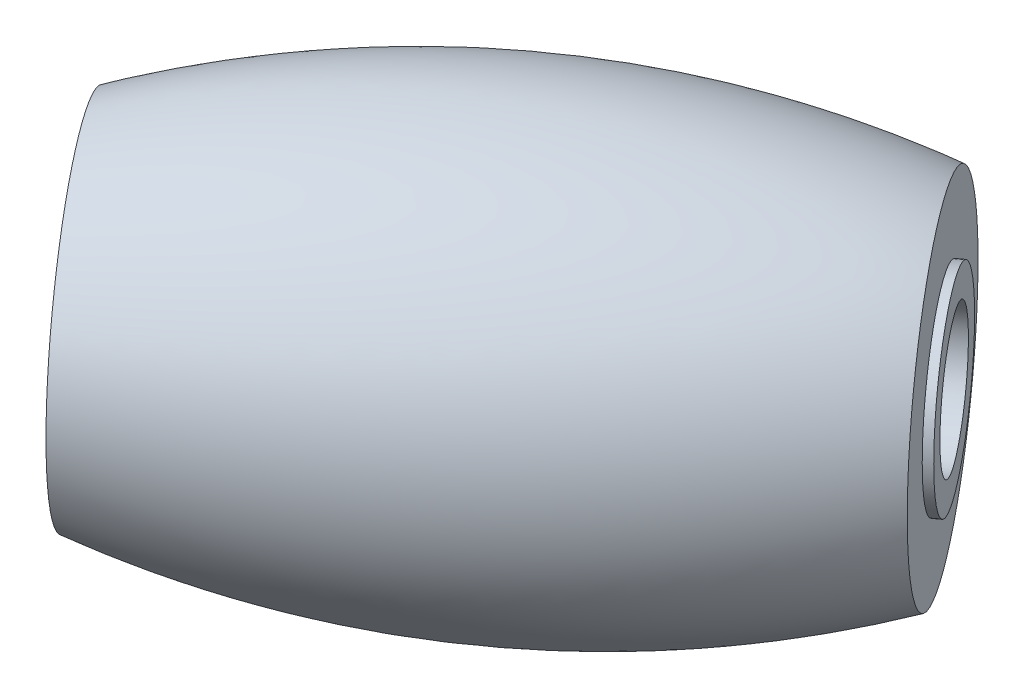
ISO-10303-21;
HEADER;
FILE_DESCRIPTION(('STEP AP214'),'2;1');
FILE_NAME('part.step','',(''),(''),'','','');
FILE_SCHEMA(('AUTOMOTIVE_DESIGN { 1 0 10303 214 1 1 1 1 }'));
ENDSEC;
DATA;
#1=APPLICATION_CONTEXT('core data for automotive mechanical design processes');
#2=APPLICATION_PROTOCOL_DEFINITION('international standard','automotive_design',2000,#1);
#3=PRODUCT_CONTEXT('',#1,'mechanical');
#4=PRODUCT('Part','Part','',(#3));
#5=PRODUCT_RELATED_PRODUCT_CATEGORY('part','',(#4));
#6=PRODUCT_DEFINITION_FORMATION('','',#4);
#7=PRODUCT_DEFINITION_CONTEXT('part definition',#1,'design');
#8=PRODUCT_DEFINITION('design','',#6,#7);
#9=PRODUCT_DEFINITION_SHAPE('','',#8);
#10=(LENGTH_UNIT() NAMED_UNIT(*) SI_UNIT(.MILLI.,.METRE.));
#11=(NAMED_UNIT(*) PLANE_ANGLE_UNIT() SI_UNIT($,.RADIAN.));
#12=(NAMED_UNIT(*) SI_UNIT($,.STERADIAN.) SOLID_ANGLE_UNIT());
#13=UNCERTAINTY_MEASURE_WITH_UNIT(LENGTH_MEASURE(1.E-05),#10,'distance_accuracy_value','');
#14=(GEOMETRIC_REPRESENTATION_CONTEXT(3) GLOBAL_UNCERTAINTY_ASSIGNED_CONTEXT((#13)) GLOBAL_UNIT_ASSIGNED_CONTEXT((#10,
#11,#12)) REPRESENTATION_CONTEXT('',''));
#15=CARTESIAN_POINT('',(0.,0.,0.));
#16=DIRECTION('',(0.,0.,1.));
#17=DIRECTION('',(1.,0.,0.));
#18=AXIS2_PLACEMENT_3D('',#15,#16,#17);
#19=CARTESIAN_POINT('',(-2.7324804469588,19.5,-20.10985167523));
#20=CARTESIAN_POINT('',(-6.53966451495307,19.5,-14.5576434821438));
#21=CARTESIAN_POINT('',(-11.9860776218319,19.5,-10.6005927349104));
#22=CARTESIAN_POINT('',(-18.4430259814176,19.5,-8.69547220628071));
#23=(BOUNDED_CURVE() B_SPLINE_CURVE(3,(#19,#20,#21,#22),.UNSPECIFIED.,.F.,
.F.) B_SPLINE_CURVE_WITH_KNOTS((4,4),(0.,1.),
.UNSPECIFIED.) CURVE() GEOMETRIC_REPRESENTATION_ITEM() RATIONAL_B_SPLINE_CURVE((1.,
0.961522456838992,0.961522456838992,1.)) REPRESENTATION_ITEM(''));
#24=CARTESIAN_POINT('',(-13.36575966883,19.5,-18.22625979987));
#25=DIRECTION('',(-0.809016994377869,0.,0.587785252288452));
#26=AXIS1_PLACEMENT('',#24,#25);
#27=SURFACE_OF_REVOLUTION('',#23,#26);
#28=CARTESIAN_POINT('',(-5.80145077141528,19.5,-23.7220519087537));
#29=DIRECTION('',(-0.809016994377869,0.,0.587785252288452));
#30=DIRECTION('',(0.587785252288452,0.,0.809016994377869));
#31=AXIS2_PLACEMENT_3D('',#28,#29,#30);
#32=CIRCLE('',#31,4.8513660861917);
#33=CARTESIAN_POINT('',(-2.94988933249946,19.5,-19.7972142990762));
#34=VERTEX_POINT('',#33);
#35=EDGE_CURVE('E19',#34,#34,#32,.T.);
#36=ORIENTED_EDGE('',*,*,#35,.T.);
#37=EDGE_LOOP('',(#36));
#38=FACE_BOUND('',#37,.T.);
#39=CARTESIAN_POINT('',(-20.9300685662801,19.5,-12.7304676909606));
#40=DIRECTION('',(-0.809016994377869,0.,0.587785252288452));
#41=DIRECTION('',(0.587785252288452,0.,0.809016994377869));
#42=AXIS2_PLACEMENT_3D('',#39,#40,#41);
#43=CIRCLE('',#42,4.85136608625089);
#44=CARTESIAN_POINT('',(-18.0785071273295,19.5,-8.80563008123517));
#45=VERTEX_POINT('',#44);
#46=EDGE_CURVE('E45',#45,#45,#43,.F.);
#47=ORIENTED_EDGE('',*,*,#46,.T.);
#48=EDGE_LOOP('',(#47));
#49=FACE_BOUND('',#48,.T.);
#50=ADVANCED_FACE('F15',(#38,#49),#27,.T.);
#51=CARTESIAN_POINT('',(-8.767074667941,14.45457927032,-27.80388302289));
#52=DIRECTION('',(-0.809016994375006,0.,0.587785252292392));
#53=DIRECTION('',(0.587785252292392,0.,0.809016994375006));
#54=AXIS2_PLACEMENT_3D('',#51,#52,#53);
#55=PLANE('',#54);
#56=CARTESIAN_POINT('',(-5.80145077143118,19.5,-23.7220519088059));
#57=DIRECTION('',(-0.809016994376138,0.,0.587785252290835));
#58=DIRECTION('',(0.587785252290835,0.,0.809016994376138));
#59=AXIS2_PLACEMENT_3D('',#56,#57,#58);
#60=CIRCLE('',#59,2.80000000000037);
#61=CARTESIAN_POINT('',(-4.15565206501663,19.5,-21.4568043245524));
#62=VERTEX_POINT('',#61);
#63=EDGE_CURVE('E43',#62,#62,#60,.T.);
#64=ORIENTED_EDGE('',*,*,#63,.T.);
#65=EDGE_LOOP('',(#64));
#66=FACE_BOUND('',#65,.T.);
#67=ORIENTED_EDGE('',*,*,#35,.F.);
#68=EDGE_LOOP('',(#67));
#69=FACE_BOUND('',#68,.T.);
#70=ADVANCED_FACE('F53',(#66,#69),#55,.F.);
#71=CARTESIAN_POINT('',(-23.89569246275,14.45457927032,-16.81229880502));
#72=DIRECTION('',(-0.809016994374912,0.,0.587785252292522));
#73=DIRECTION('',(0.587785252292522,0.,0.809016994374912));
#74=AXIS2_PLACEMENT_3D('',#71,#72,#73);
#75=PLANE('',#74);
#76=CARTESIAN_POINT('',(-20.9300685662663,19.5,-12.7304676909663));
#77=DIRECTION('',(-0.809016994376137,0.,0.587785252290836));
#78=DIRECTION('',(0.587785252290836,0.,0.809016994376137));
#79=AXIS2_PLACEMENT_3D('',#76,#77,#78);
#80=CIRCLE('',#79,2.80000000004162);
#81=CARTESIAN_POINT('',(-19.2842698598275,19.5,-10.4652201066794));
#82=VERTEX_POINT('',#81);
#83=EDGE_CURVE('E40',#82,#82,#80,.F.);
#84=ORIENTED_EDGE('',*,*,#83,.T.);
#85=EDGE_LOOP('',(#84));
#86=FACE_BOUND('',#85,.T.);
#87=ORIENTED_EDGE('',*,*,#46,.F.);
#88=EDGE_LOOP('',(#87));
#89=FACE_BOUND('',#88,.T.);
#90=ADVANCED_FACE('F55',(#86,#89),#75,.T.);
#91=CARTESIAN_POINT('',(-5.59919652282906,19.5,-23.8689982218845));
#92=DIRECTION('',(-0.809016994376138,0.,0.587785252290835));
#93=DIRECTION('',(0.587785252290835,0.,0.809016994376138));
#94=AXIS2_PLACEMENT_3D('',#91,#92,#93);
#95=CYLINDRICAL_SURFACE('',#94,2.80000000000037);
#96=ORIENTED_EDGE('',*,*,#63,.F.);
#97=EDGE_LOOP('',(#96));
#98=FACE_BOUND('',#97,.T.);
#99=CARTESIAN_POINT('',(-5.59919652282906,19.5,-23.8689982218845));
#100=DIRECTION('',(-0.809016994376138,0.,0.587785252290835));
#101=DIRECTION('',(0.587785252290835,0.,0.809016994376138));
#102=AXIS2_PLACEMENT_3D('',#99,#100,#101);
#103=CIRCLE('',#102,2.80000000000037);
#104=CARTESIAN_POINT('',(-3.95339781641451,19.5,-21.603750637631));
#105=VERTEX_POINT('',#104);
#106=EDGE_CURVE('E37',#105,#105,#103,.T.);
#107=ORIENTED_EDGE('',*,*,#106,.T.);
#108=EDGE_LOOP('',(#107));
#109=FACE_BOUND('',#108,.T.);
#110=ADVANCED_FACE('F63',(#98,#109),#95,.T.);
#111=CARTESIAN_POINT('',(-20.9300685662663,19.5,-12.7304676909663));
#112=DIRECTION('',(-0.809016994376137,0.,0.587785252290836));
#113=DIRECTION('',(0.587785252290836,0.,0.809016994376137));
#114=AXIS2_PLACEMENT_3D('',#111,#112,#113);
#115=CYLINDRICAL_SURFACE('',#114,2.80000000004162);
#116=ORIENTED_EDGE('',*,*,#83,.F.);
#117=EDGE_LOOP('',(#116));
#118=FACE_BOUND('',#117,.T.);
#119=CARTESIAN_POINT('',(-21.132322814847,19.5,-12.5835213779033));
#120=DIRECTION('',(-0.809016994376137,0.,0.587785252290836));
#121=DIRECTION('',(0.587785252290836,0.,0.809016994376137));
#122=AXIS2_PLACEMENT_3D('',#119,#120,#121);
#123=CIRCLE('',#122,2.80000000004162);
#124=CARTESIAN_POINT('',(-19.4865241084082,19.5,-10.3182737936164));
#125=VERTEX_POINT('',#124);
#126=EDGE_CURVE('E28',#125,#125,#123,.F.);
#127=ORIENTED_EDGE('',*,*,#126,.T.);
#128=EDGE_LOOP('',(#127));
#129=FACE_BOUND('',#128,.T.);
#130=ADVANCED_FACE('F78',(#118,#129),#115,.T.);
#131=CARTESIAN_POINT('',(-7.310827177509,16.58437656076,-26.2248557095));
#132=DIRECTION('',(-0.809016994374995,0.,0.587785252292408));
#133=DIRECTION('',(0.587785252292408,0.,0.809016994374995));
#134=AXIS2_PLACEMENT_3D('',#131,#132,#133);
#135=PLANE('',#134);
#136=CARTESIAN_POINT('',(-5.59919652283703,19.5,-23.8689982218787));
#137=DIRECTION('',(-0.809016994376137,0.,0.587785252290835));
#138=DIRECTION('',(0.587785252290835,0.,0.809016994376137));
#139=AXIS2_PLACEMENT_3D('',#136,#137,#138);
#140=CIRCLE('',#139,1.95000000002202);
#141=CARTESIAN_POINT('',(-4.45301528085696,19.5,-22.2914150828274));
#142=VERTEX_POINT('',#141);
#143=EDGE_CURVE('E23',#142,#142,#140,.T.);
#144=ORIENTED_EDGE('',*,*,#143,.T.);
#145=EDGE_LOOP('',(#144));
#146=FACE_BOUND('',#145,.T.);
#147=ORIENTED_EDGE('',*,*,#106,.F.);
#148=EDGE_LOOP('',(#147));
#149=FACE_BOUND('',#148,.T.);
#150=ADVANCED_FACE('F74',(#146,#149),#135,.F.);
#151=CARTESIAN_POINT('',(-22.84395346951,16.58437656076,-14.93937886549));
#152=DIRECTION('',(-0.809016994375076,0.,0.587785252292296));
#153=DIRECTION('',(0.587785252292296,0.,0.809016994375076));
#154=AXIS2_PLACEMENT_3D('',#151,#152,#153);
#155=PLANE('',#154);
#156=CARTESIAN_POINT('',(-21.1323228148484,19.5,-12.5835213779022));
#157=DIRECTION('',(-0.809016994376137,0.,0.587785252290835));
#158=DIRECTION('',(0.587785252290835,0.,0.809016994376137));
#159=AXIS2_PLACEMENT_3D('',#156,#157,#158);
#160=CIRCLE('',#159,1.95000000002202);
#161=CARTESIAN_POINT('',(-19.9861415728683,19.5,-11.0059382388509));
#162=VERTEX_POINT('',#161);
#163=EDGE_CURVE('E10',#162,#162,#160,.F.);
#164=ORIENTED_EDGE('',*,*,#163,.T.);
#165=EDGE_LOOP('',(#164));
#166=FACE_BOUND('',#165,.T.);
#167=ORIENTED_EDGE('',*,*,#126,.F.);
#168=EDGE_LOOP('',(#167));
#169=FACE_BOUND('',#168,.T.);
#170=ADVANCED_FACE('F17',(#166,#169),#155,.T.);
#171=CARTESIAN_POINT('',(-5.59919652283703,19.5,-23.8689982218787));
#172=DIRECTION('',(-0.809016994376137,0.,0.587785252290835));
#173=DIRECTION('',(0.587785252290835,0.,0.809016994376137));
#174=AXIS2_PLACEMENT_3D('',#171,#172,#173);
#175=CYLINDRICAL_SURFACE('',#174,1.95000000002202);
#176=ORIENTED_EDGE('',*,*,#143,.F.);
#177=EDGE_LOOP('',(#176));
#178=FACE_BOUND('',#177,.T.);
#179=ORIENTED_EDGE('',*,*,#163,.F.);
#180=EDGE_LOOP('',(#179));
#181=FACE_BOUND('',#180,.T.);
#182=ADVANCED_FACE('F67',(#178,#181),#175,.F.);
#183=CLOSED_SHELL('',(#50,#70,#90,#110,#130,#150,#170,#182));
#184=MANIFOLD_SOLID_BREP('B1',#183);
#185=ADVANCED_BREP_SHAPE_REPRESENTATION('',(#18,#184),#14);
#186=SHAPE_DEFINITION_REPRESENTATION(#9,#185);
ENDSEC;
END-ISO-10303-21;
